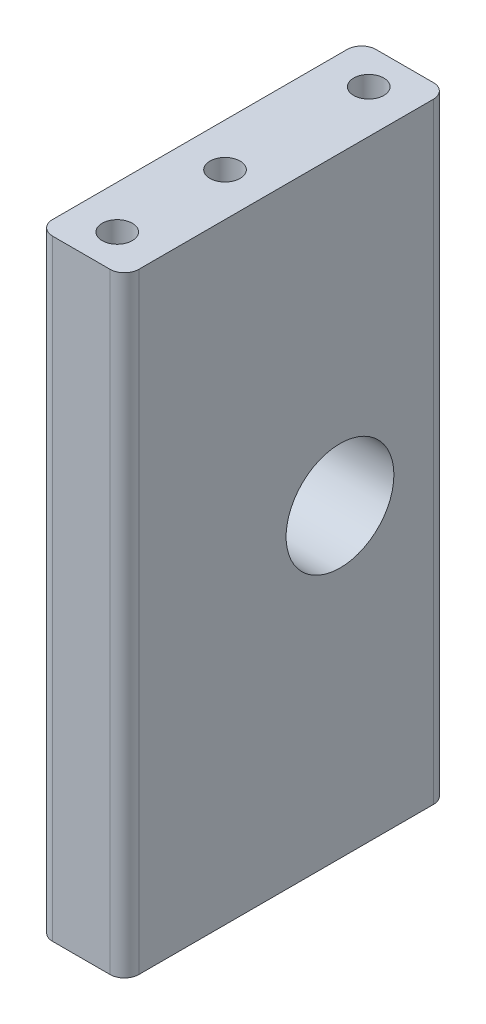
ISO-10303-21;
HEADER;
FILE_DESCRIPTION(('STEP AP214'),'2;1');
FILE_NAME('part.step','',(''),(''),'','','');
FILE_SCHEMA(('AUTOMOTIVE_DESIGN { 1 0 10303 214 1 1 1 1 }'));
ENDSEC;
DATA;
#1=APPLICATION_CONTEXT('core data for automotive mechanical design processes');
#2=APPLICATION_PROTOCOL_DEFINITION('international standard','automotive_design',2000,#1);
#3=PRODUCT_CONTEXT('',#1,'mechanical');
#4=PRODUCT('Part','Part','',(#3));
#5=PRODUCT_RELATED_PRODUCT_CATEGORY('part','',(#4));
#6=PRODUCT_DEFINITION_FORMATION('','',#4);
#7=PRODUCT_DEFINITION_CONTEXT('part definition',#1,'design');
#8=PRODUCT_DEFINITION('design','',#6,#7);
#9=PRODUCT_DEFINITION_SHAPE('','',#8);
#10=(LENGTH_UNIT() NAMED_UNIT(*) SI_UNIT(.MILLI.,.METRE.));
#11=(NAMED_UNIT(*) PLANE_ANGLE_UNIT() SI_UNIT($,.RADIAN.));
#12=(NAMED_UNIT(*) SI_UNIT($,.STERADIAN.) SOLID_ANGLE_UNIT());
#13=UNCERTAINTY_MEASURE_WITH_UNIT(LENGTH_MEASURE(1.E-05),#10,'distance_accuracy_value','');
#14=(GEOMETRIC_REPRESENTATION_CONTEXT(3) GLOBAL_UNCERTAINTY_ASSIGNED_CONTEXT((#13)) GLOBAL_UNIT_ASSIGNED_CONTEXT((#10,
#11,#12)) REPRESENTATION_CONTEXT('',''));
#15=CARTESIAN_POINT('',(0.,0.,0.));
#16=DIRECTION('',(0.,0.,1.));
#17=DIRECTION('',(1.,0.,0.));
#18=AXIS2_PLACEMENT_3D('',#15,#16,#17);
#19=CARTESIAN_POINT('',(6.,-85.,0.));
#20=DIRECTION('',(-1.,0.,0.));
#21=DIRECTION('',(0.,0.,1.));
#22=AXIS2_PLACEMENT_3D('',#19,#20,#21);
#23=PLANE('',#22);
#24=CARTESIAN_POINT('',(6.,-42.5,0.));
#25=DIRECTION('',(1.,0.,0.));
#26=DIRECTION('',(0.,0.,-1.));
#27=AXIS2_PLACEMENT_3D('',#24,#25,#26);
#28=CIRCLE('',#27,7.5);
#29=CARTESIAN_POINT('',(6.,-42.5,-7.5));
#30=VERTEX_POINT('',#29);
#31=EDGE_CURVE('E222',#30,#30,#28,.T.);
#32=ORIENTED_EDGE('',*,*,#31,.F.);
#33=EDGE_LOOP('',(#32));
#34=FACE_BOUND('',#33,.T.);
#35=DIRECTION('',(0.,0.,1.));
#36=VECTOR('',#35,1.);
#37=CARTESIAN_POINT('',(6.,-85.,0.));
#38=LINE('',#37,#36);
#39=CARTESIAN_POINT('',(6.,-85.,-13.));
#40=VERTEX_POINT('',#39);
#41=CARTESIAN_POINT('',(6.,-85.,28.));
#42=VERTEX_POINT('',#41);
#43=EDGE_CURVE('E184',#40,#42,#38,.T.);
#44=ORIENTED_EDGE('',*,*,#43,.F.);
#45=DIRECTION('',(0.,1.,0.));
#46=VECTOR('',#45,1.);
#47=CARTESIAN_POINT('',(6.,0.,-13.));
#48=LINE('',#47,#46);
#49=CARTESIAN_POINT('',(6.,0.,-13.));
#50=VERTEX_POINT('',#49);
#51=EDGE_CURVE('E174',#40,#50,#48,.T.);
#52=ORIENTED_EDGE('',*,*,#51,.T.);
#53=DIRECTION('',(0.,0.,1.));
#54=VECTOR('',#53,1.);
#55=CARTESIAN_POINT('',(6.,0.,0.));
#56=LINE('',#55,#54);
#57=CARTESIAN_POINT('',(6.,0.,28.));
#58=VERTEX_POINT('',#57);
#59=EDGE_CURVE('E112',#50,#58,#56,.T.);
#60=ORIENTED_EDGE('',*,*,#59,.T.);
#61=DIRECTION('',(0.,1.,0.));
#62=VECTOR('',#61,1.);
#63=CARTESIAN_POINT('',(6.,-85.,28.));
#64=LINE('',#63,#62);
#65=EDGE_CURVE('E171',#58,#42,#64,.F.);
#66=ORIENTED_EDGE('',*,*,#65,.T.);
#67=EDGE_LOOP('',(#44,#52,#60,#66));
#68=FACE_BOUND('',#67,.T.);
#69=ADVANCED_FACE('F41',(#34,#68),#23,.F.);
#70=CARTESIAN_POINT('',(0.,-85.,30.));
#71=DIRECTION('',(0.,0.,1.));
#72=DIRECTION('',(1.,0.,0.));
#73=AXIS2_PLACEMENT_3D('',#70,#71,#72);
#74=PLANE('',#73);
#75=DIRECTION('',(1.,0.,0.));
#76=VECTOR('',#75,1.);
#77=CARTESIAN_POINT('',(0.,0.,30.));
#78=LINE('',#77,#76);
#79=CARTESIAN_POINT('',(-4.,0.,30.));
#80=VERTEX_POINT('',#79);
#81=CARTESIAN_POINT('',(4.,0.,30.));
#82=VERTEX_POINT('',#81);
#83=EDGE_CURVE('E145',#80,#82,#78,.T.);
#84=ORIENTED_EDGE('',*,*,#83,.F.);
#85=DIRECTION('',(0.,1.,0.));
#86=VECTOR('',#85,1.);
#87=CARTESIAN_POINT('',(-4.,-85.,30.));
#88=LINE('',#87,#86);
#89=CARTESIAN_POINT('',(-4.,-85.,30.));
#90=VERTEX_POINT('',#89);
#91=EDGE_CURVE('E11',#80,#90,#88,.F.);
#92=ORIENTED_EDGE('',*,*,#91,.T.);
#93=DIRECTION('',(1.,0.,0.));
#94=VECTOR('',#93,1.);
#95=CARTESIAN_POINT('',(0.,-85.,30.));
#96=LINE('',#95,#94);
#97=CARTESIAN_POINT('',(4.,-85.,30.));
#98=VERTEX_POINT('',#97);
#99=EDGE_CURVE('E136',#90,#98,#96,.T.);
#100=ORIENTED_EDGE('',*,*,#99,.T.);
#101=DIRECTION('',(0.,1.,0.));
#102=VECTOR('',#101,1.);
#103=CARTESIAN_POINT('',(4.,0.,30.));
#104=LINE('',#103,#102);
#105=EDGE_CURVE('E50',#98,#82,#104,.T.);
#106=ORIENTED_EDGE('',*,*,#105,.T.);
#107=EDGE_LOOP('',(#84,#92,#100,#106));
#108=FACE_BOUND('',#107,.T.);
#109=ADVANCED_FACE('F180',(#108),#74,.T.);
#110=CARTESIAN_POINT('',(-6.,-85.,0.));
#111=DIRECTION('',(-1.,0.,0.));
#112=DIRECTION('',(0.,0.,1.));
#113=AXIS2_PLACEMENT_3D('',#110,#111,#112);
#114=PLANE('',#113);
#115=CARTESIAN_POINT('',(-6.,-42.5,0.));
#116=DIRECTION('',(-1.,0.,0.));
#117=DIRECTION('',(0.,0.,1.));
#118=AXIS2_PLACEMENT_3D('',#115,#116,#117);
#119=CIRCLE('',#118,7.5);
#120=CARTESIAN_POINT('',(-6.,-42.5,7.5));
#121=VERTEX_POINT('',#120);
#122=EDGE_CURVE('E223',#121,#121,#119,.F.);
#123=ORIENTED_EDGE('',*,*,#122,.T.);
#124=EDGE_LOOP('',(#123));
#125=FACE_BOUND('',#124,.T.);
#126=DIRECTION('',(0.,0.,1.));
#127=VECTOR('',#126,1.);
#128=CARTESIAN_POINT('',(-6.,0.,0.));
#129=LINE('',#128,#127);
#130=CARTESIAN_POINT('',(-6.,0.,-13.));
#131=VERTEX_POINT('',#130);
#132=CARTESIAN_POINT('',(-6.,0.,28.));
#133=VERTEX_POINT('',#132);
#134=EDGE_CURVE('E130',#131,#133,#129,.T.);
#135=ORIENTED_EDGE('',*,*,#134,.F.);
#136=DIRECTION('',(0.,1.,0.));
#137=VECTOR('',#136,1.);
#138=CARTESIAN_POINT('',(-6.,-85.,-13.));
#139=LINE('',#138,#137);
#140=CARTESIAN_POINT('',(-6.,-85.,-13.));
#141=VERTEX_POINT('',#140);
#142=EDGE_CURVE('E158',#131,#141,#139,.F.);
#143=ORIENTED_EDGE('',*,*,#142,.T.);
#144=DIRECTION('',(0.,0.,1.));
#145=VECTOR('',#144,1.);
#146=CARTESIAN_POINT('',(-6.,-85.,0.));
#147=LINE('',#146,#145);
#148=CARTESIAN_POINT('',(-6.,-85.,28.));
#149=VERTEX_POINT('',#148);
#150=EDGE_CURVE('E142',#141,#149,#147,.T.);
#151=ORIENTED_EDGE('',*,*,#150,.T.);
#152=DIRECTION('',(0.,1.,0.));
#153=VECTOR('',#152,1.);
#154=CARTESIAN_POINT('',(-6.,-85.,28.));
#155=LINE('',#154,#153);
#156=EDGE_CURVE('E154',#149,#133,#155,.T.);
#157=ORIENTED_EDGE('',*,*,#156,.T.);
#158=EDGE_LOOP('',(#135,#143,#151,#157));
#159=FACE_BOUND('',#158,.T.);
#160=ADVANCED_FACE('F258',(#125,#159),#114,.T.);
#161=CARTESIAN_POINT('',(0.,-85.,-15.));
#162=DIRECTION('',(0.,0.,-1.));
#163=DIRECTION('',(-1.,0.,0.));
#164=AXIS2_PLACEMENT_3D('',#161,#162,#163);
#165=PLANE('',#164);
#166=DIRECTION('',(-1.,0.,0.));
#167=VECTOR('',#166,1.);
#168=CARTESIAN_POINT('',(0.,-85.,-15.));
#169=LINE('',#168,#167);
#170=CARTESIAN_POINT('',(4.,-85.,-15.));
#171=VERTEX_POINT('',#170);
#172=CARTESIAN_POINT('',(-4.,-85.,-15.));
#173=VERTEX_POINT('',#172);
#174=EDGE_CURVE('E187',#171,#173,#169,.T.);
#175=ORIENTED_EDGE('',*,*,#174,.T.);
#176=DIRECTION('',(0.,1.,0.));
#177=VECTOR('',#176,1.);
#178=CARTESIAN_POINT('',(-4.,-85.,-15.));
#179=LINE('',#178,#177);
#180=CARTESIAN_POINT('',(-4.,0.,-15.));
#181=VERTEX_POINT('',#180);
#182=EDGE_CURVE('E128',#173,#181,#179,.T.);
#183=ORIENTED_EDGE('',*,*,#182,.T.);
#184=DIRECTION('',(-1.,0.,0.));
#185=VECTOR('',#184,1.);
#186=CARTESIAN_POINT('',(0.,0.,-15.));
#187=LINE('',#186,#185);
#188=CARTESIAN_POINT('',(4.,0.,-15.));
#189=VERTEX_POINT('',#188);
#190=EDGE_CURVE('E110',#189,#181,#187,.T.);
#191=ORIENTED_EDGE('',*,*,#190,.F.);
#192=DIRECTION('',(0.,1.,0.));
#193=VECTOR('',#192,1.);
#194=CARTESIAN_POINT('',(4.,-85.,-15.));
#195=LINE('',#194,#193);
#196=EDGE_CURVE('E125',#189,#171,#195,.F.);
#197=ORIENTED_EDGE('',*,*,#196,.T.);
#198=EDGE_LOOP('',(#175,#183,#191,#197));
#199=FACE_BOUND('',#198,.T.);
#200=ADVANCED_FACE('F124',(#199),#165,.T.);
#201=CARTESIAN_POINT('',(0.,-85.,0.));
#202=DIRECTION('',(0.,1.,0.));
#203=DIRECTION('',(0.,0.,1.));
#204=AXIS2_PLACEMENT_3D('',#201,#202,#203);
#205=PLANE('',#204);
#206=CARTESIAN_POINT('',(0.,-85.,-10.));
#207=DIRECTION('',(0.,1.,0.));
#208=DIRECTION('',(0.,0.,1.));
#209=AXIS2_PLACEMENT_3D('',#206,#207,#208);
#210=CIRCLE('',#209,2.09999999999999);
#211=CARTESIAN_POINT('',(0.,-85.,-7.90000000000002));
#212=VERTEX_POINT('',#211);
#213=EDGE_CURVE('E214',#212,#212,#210,.T.);
#214=ORIENTED_EDGE('',*,*,#213,.T.);
#215=EDGE_LOOP('',(#214));
#216=FACE_BOUND('',#215,.T.);
#217=CARTESIAN_POINT('',(0.,-85.,10.));
#218=DIRECTION('',(0.,1.,0.));
#219=DIRECTION('',(0.,0.,1.));
#220=AXIS2_PLACEMENT_3D('',#217,#218,#219);
#221=CIRCLE('',#220,2.09999999999999);
#222=CARTESIAN_POINT('',(0.,-85.,12.1));
#223=VERTEX_POINT('',#222);
#224=EDGE_CURVE('E206',#223,#223,#221,.T.);
#225=ORIENTED_EDGE('',*,*,#224,.T.);
#226=EDGE_LOOP('',(#225));
#227=FACE_BOUND('',#226,.T.);
#228=CARTESIAN_POINT('',(0.,-85.,25.));
#229=DIRECTION('',(0.,1.,0.));
#230=DIRECTION('',(0.,0.,1.));
#231=AXIS2_PLACEMENT_3D('',#228,#229,#230);
#232=CIRCLE('',#231,2.09999999999999);
#233=CARTESIAN_POINT('',(0.,-85.,27.1));
#234=VERTEX_POINT('',#233);
#235=EDGE_CURVE('E192',#234,#234,#232,.T.);
#236=ORIENTED_EDGE('',*,*,#235,.T.);
#237=EDGE_LOOP('',(#236));
#238=FACE_BOUND('',#237,.T.);
#239=ORIENTED_EDGE('',*,*,#150,.F.);
#240=CARTESIAN_POINT('',(-4.,-85.,-13.));
#241=DIRECTION('',(0.,1.,0.));
#242=DIRECTION('',(0.,0.,1.));
#243=AXIS2_PLACEMENT_3D('',#240,#241,#242);
#244=CIRCLE('',#243,2.);
#245=EDGE_CURVE('E168',#141,#173,#244,.F.);
#246=ORIENTED_EDGE('',*,*,#245,.T.);
#247=ORIENTED_EDGE('',*,*,#174,.F.);
#248=CARTESIAN_POINT('',(4.,-85.,-13.));
#249=DIRECTION('',(0.,1.,0.));
#250=DIRECTION('',(0.,0.,1.));
#251=AXIS2_PLACEMENT_3D('',#248,#249,#250);
#252=CIRCLE('',#251,2.);
#253=EDGE_CURVE('E134',#171,#40,#252,.F.);
#254=ORIENTED_EDGE('',*,*,#253,.T.);
#255=ORIENTED_EDGE('',*,*,#43,.T.);
#256=CARTESIAN_POINT('',(4.,-85.,28.));
#257=DIRECTION('',(0.,1.,0.));
#258=DIRECTION('',(0.,0.,1.));
#259=AXIS2_PLACEMENT_3D('',#256,#257,#258);
#260=CIRCLE('',#259,2.);
#261=EDGE_CURVE('E57',#42,#98,#260,.F.);
#262=ORIENTED_EDGE('',*,*,#261,.T.);
#263=ORIENTED_EDGE('',*,*,#99,.F.);
#264=CARTESIAN_POINT('',(-4.,-85.,28.));
#265=DIRECTION('',(0.,1.,0.));
#266=DIRECTION('',(0.,0.,1.));
#267=AXIS2_PLACEMENT_3D('',#264,#265,#266);
#268=CIRCLE('',#267,2.);
#269=EDGE_CURVE('E163',#90,#149,#268,.F.);
#270=ORIENTED_EDGE('',*,*,#269,.T.);
#271=EDGE_LOOP('',(#239,#246,#247,#254,#255,#262,#263,#270));
#272=FACE_BOUND('',#271,.T.);
#273=ADVANCED_FACE('F239',(#216,#227,#238,#272),#205,.F.);
#274=CARTESIAN_POINT('',(0.,0.,0.));
#275=DIRECTION('',(0.,1.,0.));
#276=DIRECTION('',(0.,0.,1.));
#277=AXIS2_PLACEMENT_3D('',#274,#275,#276);
#278=PLANE('',#277);
#279=CARTESIAN_POINT('',(0.,0.,-10.));
#280=DIRECTION('',(0.,1.,0.));
#281=DIRECTION('',(0.,0.,1.));
#282=AXIS2_PLACEMENT_3D('',#279,#280,#281);
#283=CIRCLE('',#282,2.09999999999999);
#284=CARTESIAN_POINT('',(0.,0.,-7.90000000000001));
#285=VERTEX_POINT('',#284);
#286=EDGE_CURVE('E218',#285,#285,#283,.T.);
#287=ORIENTED_EDGE('',*,*,#286,.F.);
#288=EDGE_LOOP('',(#287));
#289=FACE_BOUND('',#288,.T.);
#290=CARTESIAN_POINT('',(0.,0.,10.));
#291=DIRECTION('',(0.,1.,0.));
#292=DIRECTION('',(0.,0.,1.));
#293=AXIS2_PLACEMENT_3D('',#290,#291,#292);
#294=CIRCLE('',#293,2.09999999999999);
#295=CARTESIAN_POINT('',(0.,0.,12.1));
#296=VERTEX_POINT('',#295);
#297=EDGE_CURVE('E210',#296,#296,#294,.T.);
#298=ORIENTED_EDGE('',*,*,#297,.F.);
#299=EDGE_LOOP('',(#298));
#300=FACE_BOUND('',#299,.T.);
#301=CARTESIAN_POINT('',(0.,0.,25.));
#302=DIRECTION('',(0.,1.,0.));
#303=DIRECTION('',(0.,0.,1.));
#304=AXIS2_PLACEMENT_3D('',#301,#302,#303);
#305=CIRCLE('',#304,2.09999999999999);
#306=CARTESIAN_POINT('',(0.,0.,27.1));
#307=VERTEX_POINT('',#306);
#308=EDGE_CURVE('E202',#307,#307,#305,.T.);
#309=ORIENTED_EDGE('',*,*,#308,.F.);
#310=EDGE_LOOP('',(#309));
#311=FACE_BOUND('',#310,.T.);
#312=ORIENTED_EDGE('',*,*,#190,.T.);
#313=CARTESIAN_POINT('',(-4.,0.,-13.));
#314=DIRECTION('',(0.,1.,0.));
#315=DIRECTION('',(0.,0.,1.));
#316=AXIS2_PLACEMENT_3D('',#313,#314,#315);
#317=CIRCLE('',#316,2.);
#318=EDGE_CURVE('E118',#181,#131,#317,.T.);
#319=ORIENTED_EDGE('',*,*,#318,.T.);
#320=ORIENTED_EDGE('',*,*,#134,.T.);
#321=CARTESIAN_POINT('',(-4.,0.,28.));
#322=DIRECTION('',(0.,1.,0.));
#323=DIRECTION('',(0.,0.,1.));
#324=AXIS2_PLACEMENT_3D('',#321,#322,#323);
#325=CIRCLE('',#324,2.);
#326=EDGE_CURVE('E119',#133,#80,#325,.T.);
#327=ORIENTED_EDGE('',*,*,#326,.T.);
#328=ORIENTED_EDGE('',*,*,#83,.T.);
#329=CARTESIAN_POINT('',(4.,0.,28.));
#330=DIRECTION('',(0.,1.,0.));
#331=DIRECTION('',(0.,0.,1.));
#332=AXIS2_PLACEMENT_3D('',#329,#330,#331);
#333=CIRCLE('',#332,2.);
#334=EDGE_CURVE('E140',#82,#58,#333,.T.);
#335=ORIENTED_EDGE('',*,*,#334,.T.);
#336=ORIENTED_EDGE('',*,*,#59,.F.);
#337=CARTESIAN_POINT('',(4.,0.,-13.));
#338=DIRECTION('',(0.,1.,0.));
#339=DIRECTION('',(0.,0.,1.));
#340=AXIS2_PLACEMENT_3D('',#337,#338,#339);
#341=CIRCLE('',#340,2.);
#342=EDGE_CURVE('E107',#50,#189,#341,.T.);
#343=ORIENTED_EDGE('',*,*,#342,.T.);
#344=EDGE_LOOP('',(#312,#319,#320,#327,#328,#335,#336,#343));
#345=FACE_BOUND('',#344,.T.);
#346=ADVANCED_FACE('F109',(#289,#300,#311,#345),#278,.T.);
#347=CARTESIAN_POINT('',(0.,0.,25.));
#348=DIRECTION('',(0.,1.,0.));
#349=DIRECTION('',(0.,0.,1.));
#350=AXIS2_PLACEMENT_3D('',#347,#348,#349);
#351=CYLINDRICAL_SURFACE('',#350,2.09999999999999);
#352=ORIENTED_EDGE('',*,*,#235,.F.);
#353=EDGE_LOOP('',(#352));
#354=FACE_BOUND('',#353,.T.);
#355=ORIENTED_EDGE('',*,*,#308,.T.);
#356=EDGE_LOOP('',(#355));
#357=FACE_BOUND('',#356,.T.);
#358=ADVANCED_FACE('F266',(#354,#357),#351,.F.);
#359=CARTESIAN_POINT('',(0.,0.,10.));
#360=DIRECTION('',(0.,1.,0.));
#361=DIRECTION('',(0.,0.,1.));
#362=AXIS2_PLACEMENT_3D('',#359,#360,#361);
#363=CYLINDRICAL_SURFACE('',#362,2.09999999999999);
#364=ORIENTED_EDGE('',*,*,#224,.F.);
#365=EDGE_LOOP('',(#364));
#366=FACE_BOUND('',#365,.T.);
#367=ORIENTED_EDGE('',*,*,#297,.T.);
#368=EDGE_LOOP('',(#367));
#369=FACE_BOUND('',#368,.T.);
#370=ADVANCED_FACE('F273',(#366,#369),#363,.F.);
#371=CARTESIAN_POINT('',(0.,0.,-10.));
#372=DIRECTION('',(0.,1.,0.));
#373=DIRECTION('',(0.,0.,1.));
#374=AXIS2_PLACEMENT_3D('',#371,#372,#373);
#375=CYLINDRICAL_SURFACE('',#374,2.09999999999999);
#376=ORIENTED_EDGE('',*,*,#213,.F.);
#377=EDGE_LOOP('',(#376));
#378=FACE_BOUND('',#377,.T.);
#379=ORIENTED_EDGE('',*,*,#286,.T.);
#380=EDGE_LOOP('',(#379));
#381=FACE_BOUND('',#380,.T.);
#382=ADVANCED_FACE('F277',(#378,#381),#375,.F.);
#383=CARTESIAN_POINT('',(-6.001,-42.5,0.));
#384=DIRECTION('',(1.,0.,0.));
#385=DIRECTION('',(0.,0.,-1.));
#386=AXIS2_PLACEMENT_3D('',#383,#384,#385);
#387=CYLINDRICAL_SURFACE('',#386,7.5);
#388=ORIENTED_EDGE('',*,*,#122,.F.);
#389=EDGE_LOOP('',(#388));
#390=FACE_BOUND('',#389,.T.);
#391=ORIENTED_EDGE('',*,*,#31,.T.);
#392=EDGE_LOOP('',(#391));
#393=FACE_BOUND('',#392,.T.);
#394=ADVANCED_FACE('F231',(#390,#393),#387,.F.);
#395=CARTESIAN_POINT('',(-4.,-85.,-13.));
#396=DIRECTION('',(0.,1.,0.));
#397=DIRECTION('',(0.,0.,1.));
#398=AXIS2_PLACEMENT_3D('',#395,#396,#397);
#399=CYLINDRICAL_SURFACE('',#398,2.);
#400=ORIENTED_EDGE('',*,*,#245,.F.);
#401=ORIENTED_EDGE('',*,*,#142,.F.);
#402=ORIENTED_EDGE('',*,*,#318,.F.);
#403=ORIENTED_EDGE('',*,*,#182,.F.);
#404=EDGE_LOOP('',(#400,#401,#402,#403));
#405=FACE_BOUND('',#404,.T.);
#406=ADVANCED_FACE('F249',(#405),#399,.T.);
#407=CARTESIAN_POINT('',(4.,-85.,-13.));
#408=DIRECTION('',(0.,-1.,0.));
#409=DIRECTION('',(0.,0.,-1.));
#410=AXIS2_PLACEMENT_3D('',#407,#408,#409);
#411=CYLINDRICAL_SURFACE('',#410,2.);
#412=ORIENTED_EDGE('',*,*,#253,.F.);
#413=ORIENTED_EDGE('',*,*,#196,.F.);
#414=ORIENTED_EDGE('',*,*,#342,.F.);
#415=ORIENTED_EDGE('',*,*,#51,.F.);
#416=EDGE_LOOP('',(#412,#413,#414,#415));
#417=FACE_BOUND('',#416,.T.);
#418=ADVANCED_FACE('F133',(#417),#411,.T.);
#419=CARTESIAN_POINT('',(-4.,-85.,28.));
#420=DIRECTION('',(0.,1.,0.));
#421=DIRECTION('',(0.,0.,1.));
#422=AXIS2_PLACEMENT_3D('',#419,#420,#421);
#423=CYLINDRICAL_SURFACE('',#422,2.);
#424=ORIENTED_EDGE('',*,*,#269,.F.);
#425=ORIENTED_EDGE('',*,*,#91,.F.);
#426=ORIENTED_EDGE('',*,*,#326,.F.);
#427=ORIENTED_EDGE('',*,*,#156,.F.);
#428=EDGE_LOOP('',(#424,#425,#426,#427));
#429=FACE_BOUND('',#428,.T.);
#430=ADVANCED_FACE('F241',(#429),#423,.T.);
#431=CARTESIAN_POINT('',(4.,-85.,28.));
#432=DIRECTION('',(0.,-1.,0.));
#433=DIRECTION('',(0.,0.,-1.));
#434=AXIS2_PLACEMENT_3D('',#431,#432,#433);
#435=CYLINDRICAL_SURFACE('',#434,2.);
#436=ORIENTED_EDGE('',*,*,#261,.F.);
#437=ORIENTED_EDGE('',*,*,#65,.F.);
#438=ORIENTED_EDGE('',*,*,#334,.F.);
#439=ORIENTED_EDGE('',*,*,#105,.F.);
#440=EDGE_LOOP('',(#436,#437,#438,#439));
#441=FACE_BOUND('',#440,.T.);
#442=ADVANCED_FACE('F43',(#441),#435,.T.);
#443=CLOSED_SHELL('',(#69,#109,#160,#200,#273,#346,#358,#370,#382,#394,#406,#418,#430,#442));
#444=MANIFOLD_SOLID_BREP('B2',#443);
#445=ADVANCED_BREP_SHAPE_REPRESENTATION('',(#18,#444),#14);
#446=SHAPE_DEFINITION_REPRESENTATION(#9,#445);
ENDSEC;
END-ISO-10303-21;
